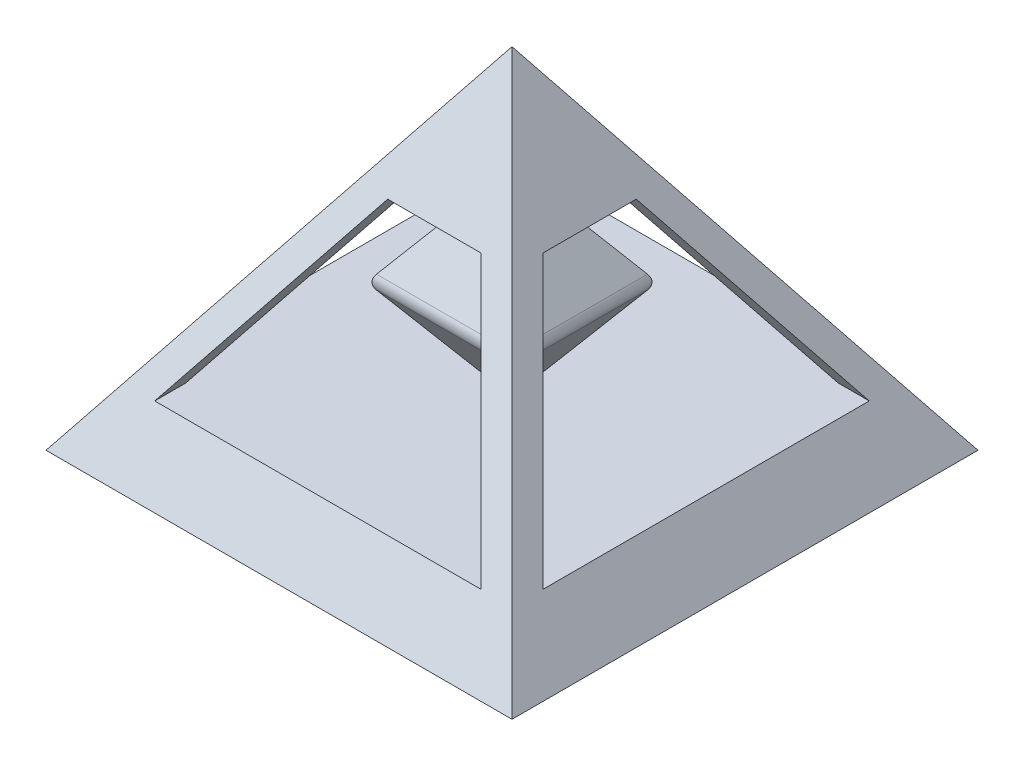
ISO-10303-21;
HEADER;
FILE_DESCRIPTION(('STEP AP214'),'2;1');
FILE_NAME('part.step','',(''),(''),'','','');
FILE_SCHEMA(('AUTOMOTIVE_DESIGN { 1 0 10303 214 1 1 1 1 }'));
ENDSEC;
DATA;
#1=APPLICATION_CONTEXT('core data for automotive mechanical design processes');
#2=APPLICATION_PROTOCOL_DEFINITION('international standard','automotive_design',2000,#1);
#3=PRODUCT_CONTEXT('',#1,'mechanical');
#4=PRODUCT('Part','Part','',(#3));
#5=PRODUCT_RELATED_PRODUCT_CATEGORY('part','',(#4));
#6=PRODUCT_DEFINITION_FORMATION('','',#4);
#7=PRODUCT_DEFINITION_CONTEXT('part definition',#1,'design');
#8=PRODUCT_DEFINITION('design','',#6,#7);
#9=PRODUCT_DEFINITION_SHAPE('','',#8);
#10=(LENGTH_UNIT() NAMED_UNIT(*) SI_UNIT(.MILLI.,.METRE.));
#11=(NAMED_UNIT(*) PLANE_ANGLE_UNIT() SI_UNIT($,.RADIAN.));
#12=(NAMED_UNIT(*) SI_UNIT($,.STERADIAN.) SOLID_ANGLE_UNIT());
#13=UNCERTAINTY_MEASURE_WITH_UNIT(LENGTH_MEASURE(1.E-05),#10,'distance_accuracy_value','');
#14=(GEOMETRIC_REPRESENTATION_CONTEXT(3) GLOBAL_UNCERTAINTY_ASSIGNED_CONTEXT((#13)) GLOBAL_UNIT_ASSIGNED_CONTEXT((#10,
#11,#12)) REPRESENTATION_CONTEXT('',''));
#15=CARTESIAN_POINT('',(0.,0.,0.));
#16=DIRECTION('',(0.,0.,1.));
#17=DIRECTION('',(1.,0.,0.));
#18=AXIS2_PLACEMENT_3D('',#15,#16,#17);
#19=CARTESIAN_POINT('',(50.,9.99999999999999,28.));
#20=DIRECTION('',(0.,1.,0.));
#21=DIRECTION('',(0.,0.,1.));
#22=AXIS2_PLACEMENT_3D('',#19,#20,#21);
#23=PLANE('',#22);
#24=DIRECTION('',(0.,0.,-1.));
#25=VECTOR('',#24,1.);
#26=CARTESIAN_POINT('',(-28.,9.99999999999999,50.));
#27=LINE('',#26,#25);
#28=CARTESIAN_POINT('',(-28.,9.99999999999999,-28.));
#29=VERTEX_POINT('',#28);
#30=CARTESIAN_POINT('',(-28.,9.99999999999999,-33.3333333333333));
#31=VERTEX_POINT('',#30);
#32=EDGE_CURVE('E490',#29,#31,#27,.T.);
#33=ORIENTED_EDGE('',*,*,#32,.F.);
#34=DIRECTION('',(-1.,0.,0.));
#35=VECTOR('',#34,1.);
#36=CARTESIAN_POINT('',(50.,9.99999999999999,-28.));
#37=LINE('',#36,#35);
#38=CARTESIAN_POINT('',(-33.3333333333333,9.99999999999999,-28.));
#39=VERTEX_POINT('',#38);
#40=EDGE_CURVE('E450',#29,#39,#37,.T.);
#41=ORIENTED_EDGE('',*,*,#40,.T.);
#42=DIRECTION('',(0.,0.,-1.));
#43=VECTOR('',#42,1.);
#44=CARTESIAN_POINT('',(-33.3333333333333,9.99999999999999,0.));
#45=LINE('',#44,#43);
#46=CARTESIAN_POINT('',(-33.3333333333333,9.99999999999999,28.));
#47=VERTEX_POINT('',#46);
#48=EDGE_CURVE('E324',#47,#39,#45,.T.);
#49=ORIENTED_EDGE('',*,*,#48,.F.);
#50=DIRECTION('',(-1.,0.,0.));
#51=VECTOR('',#50,1.);
#52=CARTESIAN_POINT('',(50.,9.99999999999999,28.));
#53=LINE('',#52,#51);
#54=CARTESIAN_POINT('',(-28.,9.99999999999999,28.));
#55=VERTEX_POINT('',#54);
#56=EDGE_CURVE('E446',#55,#47,#53,.T.);
#57=ORIENTED_EDGE('',*,*,#56,.F.);
#58=CARTESIAN_POINT('',(-28.,9.99999999999999,33.3333333333333));
#59=VERTEX_POINT('',#58);
#60=EDGE_CURVE('E489',#59,#55,#27,.T.);
#61=ORIENTED_EDGE('',*,*,#60,.F.);
#62=DIRECTION('',(-1.,0.,0.));
#63=VECTOR('',#62,1.);
#64=CARTESIAN_POINT('',(0.,9.99999999999999,33.3333333333333));
#65=LINE('',#64,#63);
#66=CARTESIAN_POINT('',(28.,10.,33.3333333333333));
#67=VERTEX_POINT('',#66);
#68=EDGE_CURVE('E470',#67,#59,#65,.T.);
#69=ORIENTED_EDGE('',*,*,#68,.F.);
#70=DIRECTION('',(0.,0.,-1.));
#71=VECTOR('',#70,1.);
#72=CARTESIAN_POINT('',(28.,10.,50.));
#73=LINE('',#72,#71);
#74=CARTESIAN_POINT('',(28.,10.,28.));
#75=VERTEX_POINT('',#74);
#76=EDGE_CURVE('E493',#67,#75,#73,.T.);
#77=ORIENTED_EDGE('',*,*,#76,.T.);
#78=CARTESIAN_POINT('',(33.3333333333333,9.99999999999999,28.));
#79=VERTEX_POINT('',#78);
#80=EDGE_CURVE('E443',#79,#75,#53,.T.);
#81=ORIENTED_EDGE('',*,*,#80,.F.);
#82=DIRECTION('',(0.,0.,1.));
#83=VECTOR('',#82,1.);
#84=CARTESIAN_POINT('',(33.3333333333333,9.99999999999999,0.));
#85=LINE('',#84,#83);
#86=CARTESIAN_POINT('',(33.3333333333333,9.99999999999999,-28.));
#87=VERTEX_POINT('',#86);
#88=EDGE_CURVE('E433',#87,#79,#85,.T.);
#89=ORIENTED_EDGE('',*,*,#88,.F.);
#90=CARTESIAN_POINT('',(28.,9.99999999999999,-28.));
#91=VERTEX_POINT('',#90);
#92=EDGE_CURVE('E447',#87,#91,#37,.T.);
#93=ORIENTED_EDGE('',*,*,#92,.T.);
#94=CARTESIAN_POINT('',(28.,10.,-33.3333333333333));
#95=VERTEX_POINT('',#94);
#96=EDGE_CURVE('E494',#91,#95,#73,.T.);
#97=ORIENTED_EDGE('',*,*,#96,.T.);
#98=DIRECTION('',(1.,0.,0.));
#99=VECTOR('',#98,1.);
#100=CARTESIAN_POINT('',(0.,9.99999999999999,-33.3333333333333));
#101=LINE('',#100,#99);
#102=EDGE_CURVE('E473',#31,#95,#101,.T.);
#103=ORIENTED_EDGE('',*,*,#102,.F.);
#104=EDGE_LOOP('',(#33,#41,#49,#57,#61,#69,#77,#81,#89,#93,#97,#103));
#105=FACE_BOUND('',#104,.T.);
#106=DIRECTION('',(-1.,0.,0.));
#107=VECTOR('',#106,1.);
#108=CARTESIAN_POINT('',(50.,9.99999999999999,1.47058823529411));
#109=LINE('',#108,#107);
#110=CARTESIAN_POINT('',(1.47058823529411,9.99999999999999,1.47058823529411));
#111=VERTEX_POINT('',#110);
#112=CARTESIAN_POINT('',(-1.47058823529411,9.99999999999999,1.47058823529411));
#113=VERTEX_POINT('',#112);
#114=EDGE_CURVE('E225',#111,#113,#109,.T.);
#115=ORIENTED_EDGE('',*,*,#114,.T.);
#116=DIRECTION('',(0.,0.,-1.));
#117=VECTOR('',#116,1.);
#118=CARTESIAN_POINT('',(-1.4705882352941,9.99999999999999,28.));
#119=LINE('',#118,#117);
#120=CARTESIAN_POINT('',(-1.47058823529411,9.99999999999999,-1.47058823529411));
#121=VERTEX_POINT('',#120);
#122=EDGE_CURVE('E224',#113,#121,#119,.T.);
#123=ORIENTED_EDGE('',*,*,#122,.T.);
#124=DIRECTION('',(1.,0.,0.));
#125=VECTOR('',#124,1.);
#126=CARTESIAN_POINT('',(50.,9.99999999999999,-1.47058823529412));
#127=LINE('',#126,#125);
#128=CARTESIAN_POINT('',(1.47058823529411,9.99999999999999,-1.47058823529411));
#129=VERTEX_POINT('',#128);
#130=EDGE_CURVE('E208',#121,#129,#127,.T.);
#131=ORIENTED_EDGE('',*,*,#130,.T.);
#132=DIRECTION('',(0.,0.,1.));
#133=VECTOR('',#132,1.);
#134=CARTESIAN_POINT('',(1.47058823529411,9.99999999999999,28.));
#135=LINE('',#134,#133);
#136=EDGE_CURVE('E216',#129,#111,#135,.T.);
#137=ORIENTED_EDGE('',*,*,#136,.T.);
#138=EDGE_LOOP('',(#115,#123,#131,#137));
#139=FACE_BOUND('',#138,.T.);
#140=ADVANCED_FACE('F49',(#105,#139),#23,.T.);
#141=CARTESIAN_POINT('',(50.,40.,0.));
#142=DIRECTION('',(0.,-1.,0.));
#143=DIRECTION('',(0.,0.,-1.));
#144=AXIS2_PLACEMENT_3D('',#141,#142,#143);
#145=PLANE('',#144);
#146=DIRECTION('',(0.,0.,-1.));
#147=VECTOR('',#146,1.);
#148=CARTESIAN_POINT('',(-8.,40.,50.));
#149=LINE('',#148,#147);
#150=CARTESIAN_POINT('',(-8.,40.,13.3333333333333));
#151=VERTEX_POINT('',#150);
#152=CARTESIAN_POINT('',(-8.,40.,8.));
#153=VERTEX_POINT('',#152);
#154=EDGE_CURVE('E485',#151,#153,#149,.T.);
#155=ORIENTED_EDGE('',*,*,#154,.T.);
#156=DIRECTION('',(-1.,0.,0.));
#157=VECTOR('',#156,1.);
#158=CARTESIAN_POINT('',(50.,40.,8.));
#159=LINE('',#158,#157);
#160=CARTESIAN_POINT('',(-13.3333333333333,40.,8.));
#161=VERTEX_POINT('',#160);
#162=EDGE_CURVE('E442',#153,#161,#159,.T.);
#163=ORIENTED_EDGE('',*,*,#162,.T.);
#164=DIRECTION('',(0.,0.,1.));
#165=VECTOR('',#164,1.);
#166=CARTESIAN_POINT('',(-13.3333333333333,40.,0.));
#167=LINE('',#166,#165);
#168=CARTESIAN_POINT('',(-13.3333333333333,40.,-8.));
#169=VERTEX_POINT('',#168);
#170=EDGE_CURVE('E318',#169,#161,#167,.T.);
#171=ORIENTED_EDGE('',*,*,#170,.F.);
#172=DIRECTION('',(-1.,0.,0.));
#173=VECTOR('',#172,1.);
#174=CARTESIAN_POINT('',(50.,40.,-8.));
#175=LINE('',#174,#173);
#176=CARTESIAN_POINT('',(-8.,40.,-7.99999999999999));
#177=VERTEX_POINT('',#176);
#178=EDGE_CURVE('E454',#177,#169,#175,.T.);
#179=ORIENTED_EDGE('',*,*,#178,.F.);
#180=CARTESIAN_POINT('',(-8.,40.,-13.3333333333333));
#181=VERTEX_POINT('',#180);
#182=EDGE_CURVE('E486',#177,#181,#149,.T.);
#183=ORIENTED_EDGE('',*,*,#182,.T.);
#184=DIRECTION('',(-1.,0.,0.));
#185=VECTOR('',#184,1.);
#186=CARTESIAN_POINT('',(0.,40.,-13.3333333333333));
#187=LINE('',#186,#185);
#188=CARTESIAN_POINT('',(8.00000000000001,40.,-13.3333333333333));
#189=VERTEX_POINT('',#188);
#190=EDGE_CURVE('E458',#189,#181,#187,.T.);
#191=ORIENTED_EDGE('',*,*,#190,.F.);
#192=DIRECTION('',(0.,0.,-1.));
#193=VECTOR('',#192,1.);
#194=CARTESIAN_POINT('',(8.,40.,50.));
#195=LINE('',#194,#193);
#196=CARTESIAN_POINT('',(8.,40.,-7.99999999999998));
#197=VERTEX_POINT('',#196);
#198=EDGE_CURVE('E497',#197,#189,#195,.T.);
#199=ORIENTED_EDGE('',*,*,#198,.F.);
#200=CARTESIAN_POINT('',(13.3333333333333,40.,-8.));
#201=VERTEX_POINT('',#200);
#202=EDGE_CURVE('E451',#201,#197,#175,.T.);
#203=ORIENTED_EDGE('',*,*,#202,.F.);
#204=DIRECTION('',(0.,0.,-1.));
#205=VECTOR('',#204,1.);
#206=CARTESIAN_POINT('',(13.3333333333333,40.,0.));
#207=LINE('',#206,#205);
#208=CARTESIAN_POINT('',(13.3333333333333,40.,8.));
#209=VERTEX_POINT('',#208);
#210=EDGE_CURVE('E397',#209,#201,#207,.T.);
#211=ORIENTED_EDGE('',*,*,#210,.F.);
#212=CARTESIAN_POINT('',(8.00000000000002,40.,8.));
#213=VERTEX_POINT('',#212);
#214=EDGE_CURVE('E439',#209,#213,#159,.T.);
#215=ORIENTED_EDGE('',*,*,#214,.T.);
#216=CARTESIAN_POINT('',(8.,40.,13.3333333333333));
#217=VERTEX_POINT('',#216);
#218=EDGE_CURVE('E496',#217,#213,#195,.T.);
#219=ORIENTED_EDGE('',*,*,#218,.F.);
#220=DIRECTION('',(1.,0.,0.));
#221=VECTOR('',#220,1.);
#222=CARTESIAN_POINT('',(0.,40.,13.3333333333333));
#223=LINE('',#222,#221);
#224=EDGE_CURVE('E455',#151,#217,#223,.T.);
#225=ORIENTED_EDGE('',*,*,#224,.F.);
#226=EDGE_LOOP('',(#155,#163,#171,#179,#183,#191,#199,#203,#211,#215,#219,#225));
#227=FACE_BOUND('',#226,.T.);
#228=DIRECTION('',(0.,0.,-1.));
#229=VECTOR('',#228,1.);
#230=CARTESIAN_POINT('',(1.47058823529412,40.,0.));
#231=LINE('',#230,#229);
#232=CARTESIAN_POINT('',(1.47058823529413,40.,1.47058823529412));
#233=VERTEX_POINT('',#232);
#234=CARTESIAN_POINT('',(1.47058823529412,40.,-1.47058823529412));
#235=VERTEX_POINT('',#234);
#236=EDGE_CURVE('E303',#233,#235,#231,.T.);
#237=ORIENTED_EDGE('',*,*,#236,.T.);
#238=DIRECTION('',(-1.,0.,0.));
#239=VECTOR('',#238,1.);
#240=CARTESIAN_POINT('',(50.,40.,-1.47058823529412));
#241=LINE('',#240,#239);
#242=CARTESIAN_POINT('',(-1.47058823529411,40.,-1.47058823529411));
#243=VERTEX_POINT('',#242);
#244=EDGE_CURVE('E221',#235,#243,#241,.T.);
#245=ORIENTED_EDGE('',*,*,#244,.T.);
#246=DIRECTION('',(0.,0.,1.));
#247=VECTOR('',#246,1.);
#248=CARTESIAN_POINT('',(-1.47058823529411,40.,0.));
#249=LINE('',#248,#247);
#250=CARTESIAN_POINT('',(-1.47058823529409,40.,1.47058823529411));
#251=VERTEX_POINT('',#250);
#252=EDGE_CURVE('E298',#243,#251,#249,.T.);
#253=ORIENTED_EDGE('',*,*,#252,.T.);
#254=DIRECTION('',(1.,0.,0.));
#255=VECTOR('',#254,1.);
#256=CARTESIAN_POINT('',(50.,40.,1.47058823529411));
#257=LINE('',#256,#255);
#258=EDGE_CURVE('E304',#251,#233,#257,.T.);
#259=ORIENTED_EDGE('',*,*,#258,.T.);
#260=EDGE_LOOP('',(#237,#245,#253,#259));
#261=FACE_BOUND('',#260,.T.);
#262=ADVANCED_FACE('F307',(#227,#261),#145,.T.);
#263=CARTESIAN_POINT('',(0.,18.4615384615385,27.6923076923077));
#264=DIRECTION('',(0.,0.554700196225229,0.832050294337844));
#265=DIRECTION('',(0.,-0.832050294337844,0.554700196225229));
#266=AXIS2_PLACEMENT_3D('',#263,#264,#265);
#267=PLANE('',#266);
#268=DIRECTION('',(-0.485071250072666,-0.727606875108999,0.485071250072666));
#269=VECTOR('',#268,1.);
#270=CARTESIAN_POINT('',(0.,60.,0.));
#271=LINE('',#270,#269);
#272=CARTESIAN_POINT('',(0.,60.,0.));
#273=VERTEX_POINT('',#272);
#274=CARTESIAN_POINT('',(-40.,0.,40.));
#275=VERTEX_POINT('',#274);
#276=EDGE_CURVE('E388',#273,#275,#271,.T.);
#277=ORIENTED_EDGE('',*,*,#276,.T.);
#278=DIRECTION('',(1.,0.,0.));
#279=VECTOR('',#278,1.);
#280=CARTESIAN_POINT('',(-40.,0.,40.));
#281=LINE('',#280,#279);
#282=CARTESIAN_POINT('',(40.,0.,40.));
#283=VERTEX_POINT('',#282);
#284=EDGE_CURVE('E383',#275,#283,#281,.T.);
#285=ORIENTED_EDGE('',*,*,#284,.T.);
#286=DIRECTION('',(0.485071250072666,-0.727606875108999,0.485071250072666));
#287=VECTOR('',#286,1.);
#288=CARTESIAN_POINT('',(0.,60.,0.));
#289=LINE('',#288,#287);
#290=EDGE_CURVE('E412',#273,#283,#289,.T.);
#291=ORIENTED_EDGE('',*,*,#290,.F.);
#292=EDGE_LOOP('',(#277,#285,#291));
#293=FACE_BOUND('',#292,.T.);
#294=DIRECTION('',(0.485071250072666,0.727606875108999,-0.485071250072666));
#295=VECTOR('',#294,1.);
#296=CARTESIAN_POINT('',(-17.0980392156863,26.3529411764706,22.4313725490196));
#297=LINE('',#296,#295);
#298=EDGE_CURVE('E461',#59,#151,#297,.T.);
#299=ORIENTED_EDGE('',*,*,#298,.T.);
#300=ORIENTED_EDGE('',*,*,#224,.T.);
#301=DIRECTION('',(0.485071250072666,-0.727606875108999,0.485071250072666));
#302=VECTOR('',#301,1.);
#303=CARTESIAN_POINT('',(17.0980392156863,26.3529411764706,22.4313725490196));
#304=LINE('',#303,#302);
#305=EDGE_CURVE('E476',#217,#67,#304,.T.);
#306=ORIENTED_EDGE('',*,*,#305,.T.);
#307=ORIENTED_EDGE('',*,*,#68,.T.);
#308=EDGE_LOOP('',(#299,#300,#306,#307));
#309=FACE_BOUND('',#308,.T.);
#310=ADVANCED_FACE('F351',(#293,#309),#267,.T.);
#311=CARTESIAN_POINT('',(0.,18.4615384615385,-27.6923076923077));
#312=DIRECTION('',(0.,0.554700196225229,-0.832050294337844));
#313=DIRECTION('',(0.,0.832050294337844,0.554700196225229));
#314=AXIS2_PLACEMENT_3D('',#311,#312,#313);
#315=PLANE('',#314);
#316=DIRECTION('',(0.485071250072666,-0.727606875108999,-0.485071250072666));
#317=VECTOR('',#316,1.);
#318=CARTESIAN_POINT('',(0.,60.,0.));
#319=LINE('',#318,#317);
#320=CARTESIAN_POINT('',(40.,0.,-40.));
#321=VERTEX_POINT('',#320);
#322=EDGE_CURVE('E330',#273,#321,#319,.T.);
#323=ORIENTED_EDGE('',*,*,#322,.T.);
#324=DIRECTION('',(-1.,0.,0.));
#325=VECTOR('',#324,1.);
#326=CARTESIAN_POINT('',(-40.,0.,-40.));
#327=LINE('',#326,#325);
#328=CARTESIAN_POINT('',(-40.,0.,-40.));
#329=VERTEX_POINT('',#328);
#330=EDGE_CURVE('E372',#321,#329,#327,.T.);
#331=ORIENTED_EDGE('',*,*,#330,.T.);
#332=DIRECTION('',(-0.485071250072666,-0.727606875108999,-0.485071250072666));
#333=VECTOR('',#332,1.);
#334=CARTESIAN_POINT('',(0.,60.,0.));
#335=LINE('',#334,#333);
#336=EDGE_CURVE('E408',#273,#329,#335,.T.);
#337=ORIENTED_EDGE('',*,*,#336,.F.);
#338=EDGE_LOOP('',(#323,#331,#337));
#339=FACE_BOUND('',#338,.T.);
#340=DIRECTION('',(-0.485071250072666,0.727606875108999,0.485071250072666));
#341=VECTOR('',#340,1.);
#342=CARTESIAN_POINT('',(17.0980392156863,26.3529411764706,-22.4313725490196));
#343=LINE('',#342,#341);
#344=EDGE_CURVE('E479',#95,#189,#343,.T.);
#345=ORIENTED_EDGE('',*,*,#344,.T.);
#346=ORIENTED_EDGE('',*,*,#190,.T.);
#347=DIRECTION('',(-0.485071250072666,-0.727606875108999,-0.485071250072666));
#348=VECTOR('',#347,1.);
#349=CARTESIAN_POINT('',(-17.0980392156863,26.3529411764706,-22.4313725490196));
#350=LINE('',#349,#348);
#351=EDGE_CURVE('E464',#181,#31,#350,.T.);
#352=ORIENTED_EDGE('',*,*,#351,.T.);
#353=ORIENTED_EDGE('',*,*,#102,.T.);
#354=EDGE_LOOP('',(#345,#346,#352,#353));
#355=FACE_BOUND('',#354,.T.);
#356=ADVANCED_FACE('F536',(#339,#355),#315,.T.);
#357=CARTESIAN_POINT('',(50.,40.,8.));
#358=DIRECTION('',(0.,-0.554700196225229,-0.832050294337844));
#359=DIRECTION('',(0.,0.832050294337844,-0.554700196225229));
#360=AXIS2_PLACEMENT_3D('',#357,#358,#359);
#361=PLANE('',#360);
#362=ORIENTED_EDGE('',*,*,#162,.F.);
#363=DIRECTION('',(-0.485071250072666,-0.727606875108999,0.485071250072666));
#364=VECTOR('',#363,1.);
#365=CARTESIAN_POINT('',(5.64705882352941,60.4705882352941,-5.64705882352941));
#366=LINE('',#365,#364);
#367=EDGE_CURVE('E467',#153,#55,#366,.T.);
#368=ORIENTED_EDGE('',*,*,#367,.T.);
#369=ORIENTED_EDGE('',*,*,#56,.T.);
#370=DIRECTION('',(-0.485071250072666,-0.727606875108999,0.485071250072666));
#371=VECTOR('',#370,1.);
#372=CARTESIAN_POINT('',(-22.4313725490196,26.3529411764706,17.0980392156863));
#373=LINE('',#372,#371);
#374=EDGE_CURVE('E321',#161,#47,#373,.T.);
#375=ORIENTED_EDGE('',*,*,#374,.F.);
#376=EDGE_LOOP('',(#362,#368,#369,#375));
#377=FACE_BOUND('',#376,.T.);
#378=ADVANCED_FACE('F533',(#377),#361,.T.);
#379=ORIENTED_EDGE('',*,*,#80,.T.);
#380=DIRECTION('',(-0.485071250072666,0.727606875108999,-0.485071250072666));
#381=VECTOR('',#380,1.);
#382=CARTESIAN_POINT('',(17.8823529411765,25.1764705882353,17.8823529411765));
#383=LINE('',#382,#381);
#384=EDGE_CURVE('E482',#75,#213,#383,.T.);
#385=ORIENTED_EDGE('',*,*,#384,.T.);
#386=ORIENTED_EDGE('',*,*,#214,.F.);
#387=DIRECTION('',(-0.485071250072666,0.727606875108999,-0.485071250072666));
#388=VECTOR('',#387,1.);
#389=CARTESIAN_POINT('',(22.4313725490196,26.3529411764706,17.0980392156863));
#390=LINE('',#389,#388);
#391=EDGE_CURVE('E430',#79,#209,#390,.T.);
#392=ORIENTED_EDGE('',*,*,#391,.F.);
#393=EDGE_LOOP('',(#379,#385,#386,#392));
#394=FACE_BOUND('',#393,.T.);
#395=ADVANCED_FACE('F535',(#394),#361,.T.);
#396=CARTESIAN_POINT('',(50.,9.99999999999999,-28.));
#397=DIRECTION('',(0.,-0.554700196225229,0.832050294337844));
#398=DIRECTION('',(0.,-0.832050294337844,-0.554700196225229));
#399=AXIS2_PLACEMENT_3D('',#396,#397,#398);
#400=PLANE('',#399);
#401=ORIENTED_EDGE('',*,*,#40,.F.);
#402=DIRECTION('',(0.485071250072666,0.727606875108999,0.485071250072666));
#403=VECTOR('',#402,1.);
#404=CARTESIAN_POINT('',(-9.64705882352943,37.5294117647059,-9.64705882352941));
#405=LINE('',#404,#403);
#406=EDGE_CURVE('E312',#29,#177,#405,.T.);
#407=ORIENTED_EDGE('',*,*,#406,.T.);
#408=ORIENTED_EDGE('',*,*,#178,.T.);
#409=DIRECTION('',(0.485071250072666,0.727606875108999,0.485071250072666));
#410=VECTOR('',#409,1.);
#411=CARTESIAN_POINT('',(-22.4313725490196,26.3529411764706,-17.0980392156863));
#412=LINE('',#411,#410);
#413=EDGE_CURVE('E327',#39,#169,#412,.T.);
#414=ORIENTED_EDGE('',*,*,#413,.F.);
#415=EDGE_LOOP('',(#401,#407,#408,#414));
#416=FACE_BOUND('',#415,.T.);
#417=ADVANCED_FACE('F531',(#416),#400,.T.);
#418=ORIENTED_EDGE('',*,*,#202,.T.);
#419=DIRECTION('',(0.485071250072666,-0.727606875108999,-0.485071250072666));
#420=VECTOR('',#419,1.);
#421=CARTESIAN_POINT('',(33.1764705882353,2.23529411764705,-33.1764705882353));
#422=LINE('',#421,#420);
#423=EDGE_CURVE('E315',#197,#91,#422,.T.);
#424=ORIENTED_EDGE('',*,*,#423,.T.);
#425=ORIENTED_EDGE('',*,*,#92,.F.);
#426=DIRECTION('',(0.485071250072666,-0.727606875108999,-0.485071250072666));
#427=VECTOR('',#426,1.);
#428=CARTESIAN_POINT('',(22.4313725490196,26.3529411764706,-17.0980392156863));
#429=LINE('',#428,#427);
#430=EDGE_CURVE('E436',#201,#87,#429,.T.);
#431=ORIENTED_EDGE('',*,*,#430,.F.);
#432=EDGE_LOOP('',(#418,#424,#425,#431));
#433=FACE_BOUND('',#432,.T.);
#434=ADVANCED_FACE('F567',(#433),#400,.T.);
#435=CARTESIAN_POINT('',(27.6923076923077,18.4615384615385,0.));
#436=DIRECTION('',(0.832050294337844,0.554700196225229,0.));
#437=DIRECTION('',(-0.554700196225229,0.832050294337844,0.));
#438=AXIS2_PLACEMENT_3D('',#435,#436,#437);
#439=PLANE('',#438);
#440=ORIENTED_EDGE('',*,*,#290,.T.);
#441=DIRECTION('',(0.,0.,-1.));
#442=VECTOR('',#441,1.);
#443=CARTESIAN_POINT('',(40.,0.,40.));
#444=LINE('',#443,#442);
#445=EDGE_CURVE('E380',#283,#321,#444,.T.);
#446=ORIENTED_EDGE('',*,*,#445,.T.);
#447=ORIENTED_EDGE('',*,*,#322,.F.);
#448=EDGE_LOOP('',(#440,#446,#447));
#449=FACE_BOUND('',#448,.T.);
#450=ORIENTED_EDGE('',*,*,#391,.T.);
#451=ORIENTED_EDGE('',*,*,#210,.T.);
#452=ORIENTED_EDGE('',*,*,#430,.T.);
#453=ORIENTED_EDGE('',*,*,#88,.T.);
#454=EDGE_LOOP('',(#450,#451,#452,#453));
#455=FACE_BOUND('',#454,.T.);
#456=ADVANCED_FACE('F571',(#449,#455),#439,.T.);
#457=CARTESIAN_POINT('',(-27.6923076923077,18.4615384615385,0.));
#458=DIRECTION('',(-0.832050294337844,0.554700196225229,0.));
#459=DIRECTION('',(-0.554700196225229,-0.832050294337844,0.));
#460=AXIS2_PLACEMENT_3D('',#457,#458,#459);
#461=PLANE('',#460);
#462=ORIENTED_EDGE('',*,*,#336,.T.);
#463=DIRECTION('',(0.,0.,1.));
#464=VECTOR('',#463,1.);
#465=CARTESIAN_POINT('',(-40.,0.,40.));
#466=LINE('',#465,#464);
#467=EDGE_CURVE('E379',#329,#275,#466,.T.);
#468=ORIENTED_EDGE('',*,*,#467,.T.);
#469=ORIENTED_EDGE('',*,*,#276,.F.);
#470=EDGE_LOOP('',(#462,#468,#469));
#471=FACE_BOUND('',#470,.T.);
#472=ORIENTED_EDGE('',*,*,#413,.T.);
#473=ORIENTED_EDGE('',*,*,#170,.T.);
#474=ORIENTED_EDGE('',*,*,#374,.T.);
#475=ORIENTED_EDGE('',*,*,#48,.T.);
#476=EDGE_LOOP('',(#472,#473,#474,#475));
#477=FACE_BOUND('',#476,.T.);
#478=ADVANCED_FACE('F348',(#471,#477),#461,.T.);
#479=CARTESIAN_POINT('',(0.,0.,0.));
#480=DIRECTION('',(0.,-1.,0.));
#481=DIRECTION('',(0.,0.,-1.));
#482=AXIS2_PLACEMENT_3D('',#479,#480,#481);
#483=PLANE('',#482);
#484=ORIENTED_EDGE('',*,*,#445,.F.);
#485=ORIENTED_EDGE('',*,*,#284,.F.);
#486=ORIENTED_EDGE('',*,*,#467,.F.);
#487=ORIENTED_EDGE('',*,*,#330,.F.);
#488=EDGE_LOOP('',(#484,#485,#486,#487));
#489=FACE_BOUND('',#488,.T.);
#490=ADVANCED_FACE('F337',(#489),#483,.T.);
#491=CARTESIAN_POINT('',(28.,10.,50.));
#492=DIRECTION('',(-0.832050294337844,-0.554700196225229,0.));
#493=DIRECTION('',(0.554700196225229,-0.832050294337843,0.));
#494=AXIS2_PLACEMENT_3D('',#491,#492,#493);
#495=PLANE('',#494);
#496=ORIENTED_EDGE('',*,*,#96,.F.);
#497=ORIENTED_EDGE('',*,*,#423,.F.);
#498=ORIENTED_EDGE('',*,*,#198,.T.);
#499=ORIENTED_EDGE('',*,*,#344,.F.);
#500=EDGE_LOOP('',(#496,#497,#498,#499));
#501=FACE_BOUND('',#500,.T.);
#502=ADVANCED_FACE('F347',(#501),#495,.T.);
#503=CARTESIAN_POINT('',(-8.,40.,50.));
#504=DIRECTION('',(0.832050294337844,-0.554700196225229,0.));
#505=DIRECTION('',(0.554700196225229,0.832050294337844,0.));
#506=AXIS2_PLACEMENT_3D('',#503,#504,#505);
#507=PLANE('',#506);
#508=ORIENTED_EDGE('',*,*,#182,.F.);
#509=ORIENTED_EDGE('',*,*,#406,.F.);
#510=ORIENTED_EDGE('',*,*,#32,.T.);
#511=ORIENTED_EDGE('',*,*,#351,.F.);
#512=EDGE_LOOP('',(#508,#509,#510,#511));
#513=FACE_BOUND('',#512,.T.);
#514=ADVANCED_FACE('F581',(#513),#507,.T.);
#515=ORIENTED_EDGE('',*,*,#60,.T.);
#516=ORIENTED_EDGE('',*,*,#367,.F.);
#517=ORIENTED_EDGE('',*,*,#154,.F.);
#518=ORIENTED_EDGE('',*,*,#298,.F.);
#519=EDGE_LOOP('',(#515,#516,#517,#518));
#520=FACE_BOUND('',#519,.T.);
#521=ADVANCED_FACE('F554',(#520),#507,.T.);
#522=ORIENTED_EDGE('',*,*,#218,.T.);
#523=ORIENTED_EDGE('',*,*,#384,.F.);
#524=ORIENTED_EDGE('',*,*,#76,.F.);
#525=ORIENTED_EDGE('',*,*,#305,.F.);
#526=EDGE_LOOP('',(#522,#523,#524,#525));
#527=FACE_BOUND('',#526,.T.);
#528=ADVANCED_FACE('F573',(#527),#495,.T.);
#529=CARTESIAN_POINT('',(0.,14.7389107243122,-20.0449185850646));
#530=DIRECTION('',(0.,-0.592390450477518,0.805651012649425));
#531=DIRECTION('',(0.,-0.805651012649425,-0.592390450477518));
#532=AXIS2_PLACEMENT_3D('',#529,#530,#531);
#533=PLANE('',#532);
#534=DIRECTION('',(-0.509673668679581,0.69315618940423,0.509673668679581));
#535=VECTOR('',#534,1.);
#536=CARTESIAN_POINT('',(12.5,25.,-12.5));
#537=LINE('',#536,#535);
#538=CARTESIAN_POINT('',(11.6288375728272,26.184780900955,-11.6288375728272));
#539=VERTEX_POINT('',#538);
#540=EDGE_CURVE('E232',#539,#235,#537,.T.);
#541=ORIENTED_EDGE('',*,*,#540,.F.);
#542=DIRECTION('',(-1.,0.,0.));
#543=VECTOR('',#542,1.);
#544=CARTESIAN_POINT('',(0.,26.184780900955,-11.6288375728272));
#545=LINE('',#544,#543);
#546=CARTESIAN_POINT('',(-11.6288375728272,26.184780900955,-11.6288375728272));
#547=VERTEX_POINT('',#546);
#548=EDGE_CURVE('E231',#539,#547,#545,.T.);
#549=ORIENTED_EDGE('',*,*,#548,.T.);
#550=DIRECTION('',(0.509673668679581,0.69315618940423,0.509673668679581));
#551=VECTOR('',#550,1.);
#552=CARTESIAN_POINT('',(-12.5,25.,-12.5));
#553=LINE('',#552,#551);
#554=EDGE_CURVE('E236',#547,#243,#553,.T.);
#555=ORIENTED_EDGE('',*,*,#554,.T.);
#556=ORIENTED_EDGE('',*,*,#244,.F.);
#557=EDGE_LOOP('',(#541,#549,#555,#556));
#558=FACE_BOUND('',#557,.T.);
#559=ADVANCED_FACE('F290',(#558),#533,.F.);
#560=CARTESIAN_POINT('',(20.0449185850646,14.7389107243122,0.));
#561=DIRECTION('',(-0.805651012649425,-0.592390450477518,0.));
#562=DIRECTION('',(0.592390450477518,-0.805651012649425,0.));
#563=AXIS2_PLACEMENT_3D('',#560,#561,#562);
#564=PLANE('',#563);
#565=DIRECTION('',(-0.509673668679581,0.69315618940423,-0.509673668679581));
#566=VECTOR('',#565,1.);
#567=CARTESIAN_POINT('',(12.5,25.,12.5));
#568=LINE('',#567,#566);
#569=CARTESIAN_POINT('',(11.6288375728272,26.184780900955,11.6288375728272));
#570=VERTEX_POINT('',#569);
#571=EDGE_CURVE('E252',#570,#233,#568,.T.);
#572=ORIENTED_EDGE('',*,*,#571,.F.);
#573=DIRECTION('',(0.,0.,-1.));
#574=VECTOR('',#573,1.);
#575=CARTESIAN_POINT('',(11.6288375728272,26.184780900955,0.));
#576=LINE('',#575,#574);
#577=EDGE_CURVE('E58',#570,#539,#576,.T.);
#578=ORIENTED_EDGE('',*,*,#577,.T.);
#579=ORIENTED_EDGE('',*,*,#540,.T.);
#580=ORIENTED_EDGE('',*,*,#236,.F.);
#581=EDGE_LOOP('',(#572,#578,#579,#580));
#582=FACE_BOUND('',#581,.T.);
#583=ADVANCED_FACE('F503',(#582),#564,.F.);
#584=CARTESIAN_POINT('',(-20.0449185850646,14.7389107243122,0.));
#585=DIRECTION('',(0.805651012649425,-0.592390450477518,0.));
#586=DIRECTION('',(0.592390450477518,0.805651012649425,0.));
#587=AXIS2_PLACEMENT_3D('',#584,#585,#586);
#588=PLANE('',#587);
#589=ORIENTED_EDGE('',*,*,#554,.F.);
#590=DIRECTION('',(0.,0.,1.));
#591=VECTOR('',#590,1.);
#592=CARTESIAN_POINT('',(-11.6288375728272,26.184780900955,0.));
#593=LINE('',#592,#591);
#594=CARTESIAN_POINT('',(-11.6288375728272,26.184780900955,11.6288375728272));
#595=VERTEX_POINT('',#594);
#596=EDGE_CURVE('E253',#547,#595,#593,.T.);
#597=ORIENTED_EDGE('',*,*,#596,.T.);
#598=DIRECTION('',(0.509673668679581,0.69315618940423,-0.509673668679581));
#599=VECTOR('',#598,1.);
#600=CARTESIAN_POINT('',(-12.5,25.,12.5));
#601=LINE('',#600,#599);
#602=EDGE_CURVE('E235',#595,#251,#601,.T.);
#603=ORIENTED_EDGE('',*,*,#602,.T.);
#604=ORIENTED_EDGE('',*,*,#252,.F.);
#605=EDGE_LOOP('',(#589,#597,#603,#604));
#606=FACE_BOUND('',#605,.T.);
#607=ADVANCED_FACE('F296',(#606),#588,.F.);
#608=CARTESIAN_POINT('',(0.,14.7389107243122,20.0449185850646));
#609=DIRECTION('',(0.,-0.592390450477518,-0.805651012649425));
#610=DIRECTION('',(0.,0.805651012649425,-0.592390450477518));
#611=AXIS2_PLACEMENT_3D('',#608,#609,#610);
#612=PLANE('',#611);
#613=ORIENTED_EDGE('',*,*,#602,.F.);
#614=DIRECTION('',(1.,0.,0.));
#615=VECTOR('',#614,1.);
#616=CARTESIAN_POINT('',(0.,26.184780900955,11.6288375728272));
#617=LINE('',#616,#615);
#618=EDGE_CURVE('E72',#595,#570,#617,.T.);
#619=ORIENTED_EDGE('',*,*,#618,.T.);
#620=ORIENTED_EDGE('',*,*,#571,.T.);
#621=ORIENTED_EDGE('',*,*,#258,.F.);
#622=EDGE_LOOP('',(#613,#619,#620,#621));
#623=FACE_BOUND('',#622,.T.);
#624=ADVANCED_FACE('F501',(#623),#612,.F.);
#625=CARTESIAN_POINT('',(3.81807973048849,2.80741156653566,0.));
#626=DIRECTION('',(0.805651012649425,0.592390450477518,0.));
#627=DIRECTION('',(-0.592390450477518,0.805651012649425,0.));
#628=AXIS2_PLACEMENT_3D('',#625,#626,#627);
#629=PLANE('',#628);
#630=DIRECTION('',(0.509673668679581,-0.69315618940423,-0.509673668679581));
#631=VECTOR('',#630,1.);
#632=CARTESIAN_POINT('',(-12.5,25.,12.5));
#633=LINE('',#632,#631);
#634=CARTESIAN_POINT('',(-11.6288375728272,23.815219099045,11.6288375728272));
#635=VERTEX_POINT('',#634);
#636=EDGE_CURVE('E213',#635,#113,#633,.T.);
#637=ORIENTED_EDGE('',*,*,#636,.F.);
#638=DIRECTION('',(0.,0.,1.));
#639=VECTOR('',#638,1.);
#640=CARTESIAN_POINT('',(-11.6288375728272,23.815219099045,0.));
#641=LINE('',#640,#639);
#642=CARTESIAN_POINT('',(-11.6288375728272,23.815219099045,-11.6288375728272));
#643=VERTEX_POINT('',#642);
#644=EDGE_CURVE('E255',#635,#643,#641,.F.);
#645=ORIENTED_EDGE('',*,*,#644,.T.);
#646=DIRECTION('',(0.509673668679581,-0.69315618940423,0.509673668679581));
#647=VECTOR('',#646,1.);
#648=CARTESIAN_POINT('',(-12.5,25.,-12.5));
#649=LINE('',#648,#647);
#650=EDGE_CURVE('E258',#643,#121,#649,.T.);
#651=ORIENTED_EDGE('',*,*,#650,.T.);
#652=ORIENTED_EDGE('',*,*,#122,.F.);
#653=EDGE_LOOP('',(#637,#645,#651,#652));
#654=FACE_BOUND('',#653,.T.);
#655=ADVANCED_FACE('F509',(#654),#629,.F.);
#656=CARTESIAN_POINT('',(0.,2.80741156653566,-3.81807973048849));
#657=DIRECTION('',(0.,0.592390450477518,-0.805651012649424));
#658=DIRECTION('',(0.,0.805651012649425,0.592390450477518));
#659=AXIS2_PLACEMENT_3D('',#656,#657,#658);
#660=PLANE('',#659);
#661=DIRECTION('',(-0.509673668679581,-0.69315618940423,-0.509673668679581));
#662=VECTOR('',#661,1.);
#663=CARTESIAN_POINT('',(12.5,25.,12.5));
#664=LINE('',#663,#662);
#665=CARTESIAN_POINT('',(11.6288375728272,23.815219099045,11.6288375728272));
#666=VERTEX_POINT('',#665);
#667=EDGE_CURVE('E212',#666,#111,#664,.T.);
#668=ORIENTED_EDGE('',*,*,#667,.F.);
#669=DIRECTION('',(1.,0.,0.));
#670=VECTOR('',#669,1.);
#671=CARTESIAN_POINT('',(0.,23.815219099045,11.6288375728272));
#672=LINE('',#671,#670);
#673=EDGE_CURVE('E267',#666,#635,#672,.F.);
#674=ORIENTED_EDGE('',*,*,#673,.T.);
#675=ORIENTED_EDGE('',*,*,#636,.T.);
#676=ORIENTED_EDGE('',*,*,#114,.F.);
#677=EDGE_LOOP('',(#668,#674,#675,#676));
#678=FACE_BOUND('',#677,.T.);
#679=ADVANCED_FACE('F513',(#678),#660,.F.);
#680=CARTESIAN_POINT('',(0.,2.80741156653566,3.81807973048849));
#681=DIRECTION('',(0.,0.592390450477518,0.805651012649424));
#682=DIRECTION('',(0.,-0.805651012649425,0.592390450477518));
#683=AXIS2_PLACEMENT_3D('',#680,#681,#682);
#684=PLANE('',#683);
#685=ORIENTED_EDGE('',*,*,#650,.F.);
#686=DIRECTION('',(-1.,0.,0.));
#687=VECTOR('',#686,1.);
#688=CARTESIAN_POINT('',(0.,23.815219099045,-11.6288375728272));
#689=LINE('',#688,#687);
#690=CARTESIAN_POINT('',(11.6288375728272,23.815219099045,-11.6288375728272));
#691=VERTEX_POINT('',#690);
#692=EDGE_CURVE('E211',#643,#691,#689,.F.);
#693=ORIENTED_EDGE('',*,*,#692,.T.);
#694=DIRECTION('',(-0.509673668679581,-0.69315618940423,0.509673668679581));
#695=VECTOR('',#694,1.);
#696=CARTESIAN_POINT('',(12.5,25.,-12.5));
#697=LINE('',#696,#695);
#698=EDGE_CURVE('E203',#691,#129,#697,.T.);
#699=ORIENTED_EDGE('',*,*,#698,.T.);
#700=ORIENTED_EDGE('',*,*,#130,.F.);
#701=EDGE_LOOP('',(#685,#693,#699,#700));
#702=FACE_BOUND('',#701,.T.);
#703=ADVANCED_FACE('F206',(#702),#684,.F.);
#704=CARTESIAN_POINT('',(-3.81807973048849,2.80741156653566,0.));
#705=DIRECTION('',(-0.805651012649424,0.592390450477518,0.));
#706=DIRECTION('',(-0.592390450477518,-0.805651012649425,0.));
#707=AXIS2_PLACEMENT_3D('',#704,#705,#706);
#708=PLANE('',#707);
#709=ORIENTED_EDGE('',*,*,#698,.F.);
#710=DIRECTION('',(0.,0.,-1.));
#711=VECTOR('',#710,1.);
#712=CARTESIAN_POINT('',(11.6288375728272,23.815219099045,0.));
#713=LINE('',#712,#711);
#714=EDGE_CURVE('E12',#691,#666,#713,.F.);
#715=ORIENTED_EDGE('',*,*,#714,.T.);
#716=ORIENTED_EDGE('',*,*,#667,.T.);
#717=ORIENTED_EDGE('',*,*,#136,.F.);
#718=EDGE_LOOP('',(#709,#715,#716,#717));
#719=FACE_BOUND('',#718,.T.);
#720=ADVANCED_FACE('F217',(#719),#708,.F.);
#721=CARTESIAN_POINT('',(0.,25.,10.0175355475283));
#722=DIRECTION('',(1.,0.,0.));
#723=DIRECTION('',(0.,0.,-1.));
#724=AXIS2_PLACEMENT_3D('',#721,#722,#723);
#725=CYLINDRICAL_SURFACE('',#724,2.);
#726=CARTESIAN_POINT('',(-10.0175355475283,25.,10.0175355475283));
#727=DIRECTION('',(0.707106781186548,0.,0.707106781186547));
#728=DIRECTION('',(0.707106781186547,0.,-0.707106781186548));
#729=AXIS2_PLACEMENT_3D('',#726,#727,#728);
#730=ELLIPSE('',#729,2.82842712474619,2.);
#731=EDGE_CURVE('E273',#635,#595,#730,.F.);
#732=ORIENTED_EDGE('',*,*,#731,.F.);
#733=ORIENTED_EDGE('',*,*,#673,.F.);
#734=CARTESIAN_POINT('',(10.0175355475283,25.,10.0175355475283));
#735=DIRECTION('',(0.707106781186547,0.,-0.707106781186548));
#736=DIRECTION('',(-0.707106781186548,0.,-0.707106781186547));
#737=AXIS2_PLACEMENT_3D('',#734,#735,#736);
#738=ELLIPSE('',#737,2.82842712474619,2.);
#739=EDGE_CURVE('E53',#570,#666,#738,.T.);
#740=ORIENTED_EDGE('',*,*,#739,.F.);
#741=ORIENTED_EDGE('',*,*,#618,.F.);
#742=EDGE_LOOP('',(#732,#733,#740,#741));
#743=FACE_BOUND('',#742,.T.);
#744=ADVANCED_FACE('F51',(#743),#725,.T.);
#745=CARTESIAN_POINT('',(10.0175355475283,25.,0.));
#746=DIRECTION('',(0.,0.,-1.));
#747=DIRECTION('',(-1.,0.,0.));
#748=AXIS2_PLACEMENT_3D('',#745,#746,#747);
#749=CYLINDRICAL_SURFACE('',#748,2.);
#750=ORIENTED_EDGE('',*,*,#739,.T.);
#751=ORIENTED_EDGE('',*,*,#714,.F.);
#752=CARTESIAN_POINT('',(10.0175355475283,25.,-10.0175355475283));
#753=DIRECTION('',(-0.707106781186548,0.,-0.707106781186547));
#754=DIRECTION('',(0.707106781186547,0.,-0.707106781186548));
#755=AXIS2_PLACEMENT_3D('',#752,#753,#754);
#756=ELLIPSE('',#755,2.82842712474619,2.);
#757=EDGE_CURVE('E272',#539,#691,#756,.T.);
#758=ORIENTED_EDGE('',*,*,#757,.F.);
#759=ORIENTED_EDGE('',*,*,#577,.F.);
#760=EDGE_LOOP('',(#750,#751,#758,#759));
#761=FACE_BOUND('',#760,.T.);
#762=ADVANCED_FACE('F504',(#761),#749,.T.);
#763=CARTESIAN_POINT('',(-10.0175355475283,25.,0.));
#764=DIRECTION('',(0.,0.,1.));
#765=DIRECTION('',(1.,0.,0.));
#766=AXIS2_PLACEMENT_3D('',#763,#764,#765);
#767=CYLINDRICAL_SURFACE('',#766,2.);
#768=ORIENTED_EDGE('',*,*,#731,.T.);
#769=ORIENTED_EDGE('',*,*,#596,.F.);
#770=CARTESIAN_POINT('',(-10.0175355475283,25.,-10.0175355475283));
#771=DIRECTION('',(-0.707106781186547,0.,0.707106781186548));
#772=DIRECTION('',(0.707106781186548,0.,0.707106781186547));
#773=AXIS2_PLACEMENT_3D('',#770,#771,#772);
#774=ELLIPSE('',#773,2.82842712474619,2.);
#775=EDGE_CURVE('E270',#643,#547,#774,.F.);
#776=ORIENTED_EDGE('',*,*,#775,.F.);
#777=ORIENTED_EDGE('',*,*,#644,.F.);
#778=EDGE_LOOP('',(#768,#769,#776,#777));
#779=FACE_BOUND('',#778,.T.);
#780=ADVANCED_FACE('F507',(#779),#767,.T.);
#781=CARTESIAN_POINT('',(0.,25.,-10.0175355475283));
#782=DIRECTION('',(-1.,0.,0.));
#783=DIRECTION('',(0.,0.,1.));
#784=AXIS2_PLACEMENT_3D('',#781,#782,#783);
#785=CYLINDRICAL_SURFACE('',#784,2.);
#786=ORIENTED_EDGE('',*,*,#757,.T.);
#787=ORIENTED_EDGE('',*,*,#692,.F.);
#788=ORIENTED_EDGE('',*,*,#775,.T.);
#789=ORIENTED_EDGE('',*,*,#548,.F.);
#790=EDGE_LOOP('',(#786,#787,#788,#789));
#791=FACE_BOUND('',#790,.T.);
#792=ADVANCED_FACE('F505',(#791),#785,.T.);
#793=CLOSED_SHELL('',(#140,#262,#310,#356,#378,#395,#417,#434,#456,#478,#490,#502,#514,#521,
#528,#559,#583,#607,#624,#655,#679,#703,#720,#744,#762,#780,#792));
#794=MANIFOLD_SOLID_BREP('B2',#793);
#795=ADVANCED_BREP_SHAPE_REPRESENTATION('',(#18,#794),#14);
#796=SHAPE_DEFINITION_REPRESENTATION(#9,#795);
ENDSEC;
END-ISO-10303-21;
